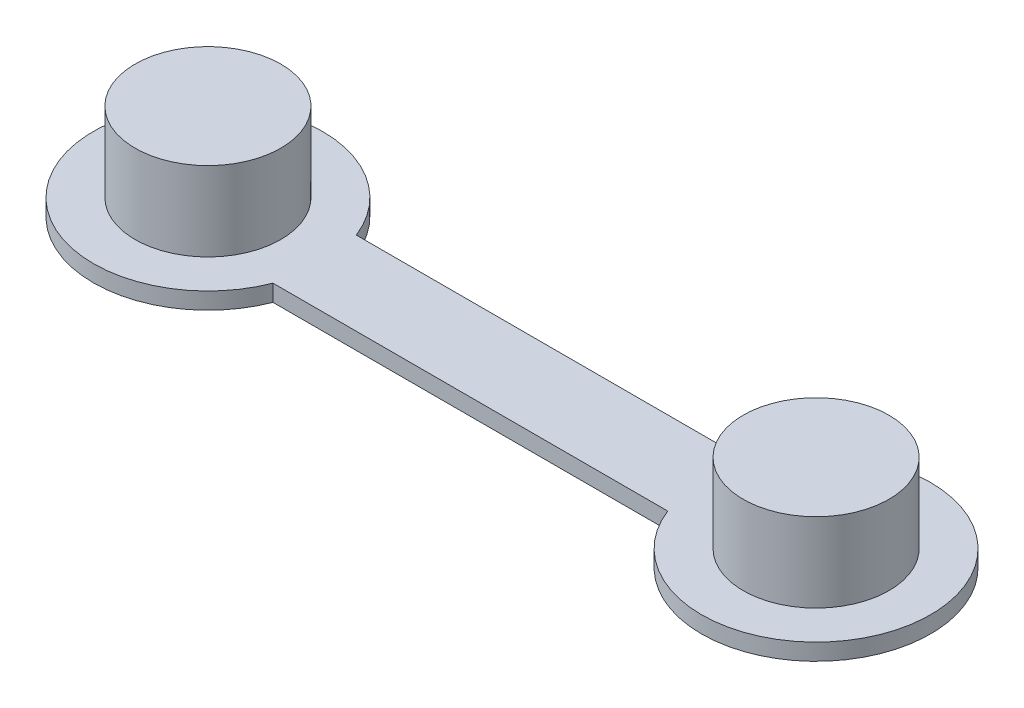
ISO-10303-21;
HEADER;
FILE_DESCRIPTION(('STEP AP214'),'2;1');
FILE_NAME('part.step','',(''),(''),'','','');
FILE_SCHEMA(('AUTOMOTIVE_DESIGN { 1 0 10303 214 1 1 1 1 }'));
ENDSEC;
DATA;
#1=APPLICATION_CONTEXT('core data for automotive mechanical design processes');
#2=APPLICATION_PROTOCOL_DEFINITION('international standard','automotive_design',2000,#1);
#3=PRODUCT_CONTEXT('',#1,'mechanical');
#4=PRODUCT('Part','Part','',(#3));
#5=PRODUCT_RELATED_PRODUCT_CATEGORY('part','',(#4));
#6=PRODUCT_DEFINITION_FORMATION('','',#4);
#7=PRODUCT_DEFINITION_CONTEXT('part definition',#1,'design');
#8=PRODUCT_DEFINITION('design','',#6,#7);
#9=PRODUCT_DEFINITION_SHAPE('','',#8);
#10=(LENGTH_UNIT() NAMED_UNIT(*) SI_UNIT(.MILLI.,.METRE.));
#11=(NAMED_UNIT(*) PLANE_ANGLE_UNIT() SI_UNIT($,.RADIAN.));
#12=(NAMED_UNIT(*) SI_UNIT($,.STERADIAN.) SOLID_ANGLE_UNIT());
#13=UNCERTAINTY_MEASURE_WITH_UNIT(LENGTH_MEASURE(1.E-05),#10,'distance_accuracy_value','');
#14=(GEOMETRIC_REPRESENTATION_CONTEXT(3) GLOBAL_UNCERTAINTY_ASSIGNED_CONTEXT((#13)) GLOBAL_UNIT_ASSIGNED_CONTEXT((#10,
#11,#12)) REPRESENTATION_CONTEXT('',''));
#15=CARTESIAN_POINT('',(0.,0.,0.));
#16=DIRECTION('',(0.,0.,1.));
#17=DIRECTION('',(1.,0.,0.));
#18=AXIS2_PLACEMENT_3D('',#15,#16,#17);
#19=CARTESIAN_POINT('',(14.6,0.4,0.));
#20=DIRECTION('',(0.,-1.,0.));
#21=DIRECTION('',(0.,0.,-1.));
#22=AXIS2_PLACEMENT_3D('',#19,#20,#21);
#23=CYLINDRICAL_SURFACE('',#22,2.75);
#24=CARTESIAN_POINT('',(14.6,0.,0.));
#25=DIRECTION('',(0.,1.,0.));
#26=DIRECTION('',(0.,0.,1.));
#27=AXIS2_PLACEMENT_3D('',#24,#25,#26);
#28=CIRCLE('',#27,2.75);
#29=CARTESIAN_POINT('',(12.0382623085101,0.,1.));
#30=VERTEX_POINT('',#29);
#31=CARTESIAN_POINT('',(12.0382623085101,0.,-1.));
#32=VERTEX_POINT('',#31);
#33=EDGE_CURVE('E111',#30,#32,#28,.T.);
#34=ORIENTED_EDGE('',*,*,#33,.T.);
#35=DIRECTION('',(0.,-1.,0.));
#36=VECTOR('',#35,1.);
#37=CARTESIAN_POINT('',(12.0382623085101,0.4,-1.));
#38=LINE('',#37,#36);
#39=CARTESIAN_POINT('',(12.0382623085101,0.4,-1.));
#40=VERTEX_POINT('',#39);
#41=EDGE_CURVE('E11',#40,#32,#38,.T.);
#42=ORIENTED_EDGE('',*,*,#41,.F.);
#43=CARTESIAN_POINT('',(14.6,0.4,0.));
#44=DIRECTION('',(0.,1.,0.));
#45=DIRECTION('',(0.,0.,1.));
#46=AXIS2_PLACEMENT_3D('',#43,#44,#45);
#47=CIRCLE('',#46,2.75);
#48=CARTESIAN_POINT('',(12.0382623085101,0.4,1.));
#49=VERTEX_POINT('',#48);
#50=EDGE_CURVE('E95',#49,#40,#47,.T.);
#51=ORIENTED_EDGE('',*,*,#50,.F.);
#52=DIRECTION('',(0.,-1.,0.));
#53=VECTOR('',#52,1.);
#54=CARTESIAN_POINT('',(12.0382623085101,0.4,1.));
#55=LINE('',#54,#53);
#56=EDGE_CURVE('E107',#49,#30,#55,.T.);
#57=ORIENTED_EDGE('',*,*,#56,.T.);
#58=EDGE_LOOP('',(#34,#42,#51,#57));
#59=FACE_BOUND('',#58,.T.);
#60=ADVANCED_FACE('F43',(#59),#23,.T.);
#61=CARTESIAN_POINT('',(2.5617376914899,0.4,-1.));
#62=DIRECTION('',(0.,0.,1.));
#63=DIRECTION('',(1.,0.,0.));
#64=AXIS2_PLACEMENT_3D('',#61,#62,#63);
#65=PLANE('',#64);
#66=DIRECTION('',(-1.,0.,0.));
#67=VECTOR('',#66,1.);
#68=CARTESIAN_POINT('',(2.5617376914899,0.,-1.));
#69=LINE('',#68,#67);
#70=CARTESIAN_POINT('',(2.5617376914899,0.,-1.));
#71=VERTEX_POINT('',#70);
#72=EDGE_CURVE('E100',#32,#71,#69,.T.);
#73=ORIENTED_EDGE('',*,*,#72,.T.);
#74=DIRECTION('',(0.,-1.,0.));
#75=VECTOR('',#74,1.);
#76=CARTESIAN_POINT('',(2.5617376914899,0.4,-1.));
#77=LINE('',#76,#75);
#78=CARTESIAN_POINT('',(2.5617376914899,0.4,-1.));
#79=VERTEX_POINT('',#78);
#80=EDGE_CURVE('E52',#79,#71,#77,.T.);
#81=ORIENTED_EDGE('',*,*,#80,.F.);
#82=DIRECTION('',(-1.,0.,0.));
#83=VECTOR('',#82,1.);
#84=CARTESIAN_POINT('',(2.5617376914899,0.4,-1.));
#85=LINE('',#84,#83);
#86=EDGE_CURVE('E90',#40,#79,#85,.T.);
#87=ORIENTED_EDGE('',*,*,#86,.F.);
#88=ORIENTED_EDGE('',*,*,#41,.T.);
#89=EDGE_LOOP('',(#73,#81,#87,#88));
#90=FACE_BOUND('',#89,.T.);
#91=ADVANCED_FACE('F99',(#90),#65,.F.);
#92=CARTESIAN_POINT('',(0.,0.4,0.));
#93=DIRECTION('',(0.,-1.,0.));
#94=DIRECTION('',(0.,0.,-1.));
#95=AXIS2_PLACEMENT_3D('',#92,#93,#94);
#96=CYLINDRICAL_SURFACE('',#95,2.75);
#97=CARTESIAN_POINT('',(0.,0.,0.));
#98=DIRECTION('',(0.,1.,0.));
#99=DIRECTION('',(0.,0.,1.));
#100=AXIS2_PLACEMENT_3D('',#97,#98,#99);
#101=CIRCLE('',#100,2.75);
#102=CARTESIAN_POINT('',(2.5617376914899,0.,1.));
#103=VERTEX_POINT('',#102);
#104=EDGE_CURVE('E77',#71,#103,#101,.T.);
#105=ORIENTED_EDGE('',*,*,#104,.T.);
#106=DIRECTION('',(0.,-1.,0.));
#107=VECTOR('',#106,1.);
#108=CARTESIAN_POINT('',(2.5617376914899,0.4,1.));
#109=LINE('',#108,#107);
#110=CARTESIAN_POINT('',(2.5617376914899,0.4,1.));
#111=VERTEX_POINT('',#110);
#112=EDGE_CURVE('E102',#111,#103,#109,.T.);
#113=ORIENTED_EDGE('',*,*,#112,.F.);
#114=CARTESIAN_POINT('',(0.,0.4,0.));
#115=DIRECTION('',(0.,1.,0.));
#116=DIRECTION('',(0.,0.,1.));
#117=AXIS2_PLACEMENT_3D('',#114,#115,#116);
#118=CIRCLE('',#117,2.75);
#119=EDGE_CURVE('E93',#79,#111,#118,.T.);
#120=ORIENTED_EDGE('',*,*,#119,.F.);
#121=ORIENTED_EDGE('',*,*,#80,.T.);
#122=EDGE_LOOP('',(#105,#113,#120,#121));
#123=FACE_BOUND('',#122,.T.);
#124=ADVANCED_FACE('F103',(#123),#96,.T.);
#125=CARTESIAN_POINT('',(12.0382623085101,0.4,1.));
#126=DIRECTION('',(0.,0.,-1.));
#127=DIRECTION('',(-1.,0.,0.));
#128=AXIS2_PLACEMENT_3D('',#125,#126,#127);
#129=PLANE('',#128);
#130=DIRECTION('',(1.,0.,0.));
#131=VECTOR('',#130,1.);
#132=CARTESIAN_POINT('',(12.0382623085101,0.,1.));
#133=LINE('',#132,#131);
#134=EDGE_CURVE('E83',#103,#30,#133,.T.);
#135=ORIENTED_EDGE('',*,*,#134,.T.);
#136=ORIENTED_EDGE('',*,*,#56,.F.);
#137=DIRECTION('',(1.,0.,0.));
#138=VECTOR('',#137,1.);
#139=CARTESIAN_POINT('',(12.0382623085101,0.4,1.));
#140=LINE('',#139,#138);
#141=EDGE_CURVE('E60',#111,#49,#140,.T.);
#142=ORIENTED_EDGE('',*,*,#141,.F.);
#143=ORIENTED_EDGE('',*,*,#112,.T.);
#144=EDGE_LOOP('',(#135,#136,#142,#143));
#145=FACE_BOUND('',#144,.T.);
#146=ADVANCED_FACE('F125',(#145),#129,.F.);
#147=CARTESIAN_POINT('',(14.6,0.4,0.));
#148=DIRECTION('',(0.,1.,0.));
#149=DIRECTION('',(0.,0.,1.));
#150=AXIS2_PLACEMENT_3D('',#147,#148,#149);
#151=PLANE('',#150);
#152=CARTESIAN_POINT('',(14.6,0.4,0.));
#153=DIRECTION('',(0.,1.,0.));
#154=DIRECTION('',(0.,0.,1.));
#155=AXIS2_PLACEMENT_3D('',#152,#153,#154);
#156=CIRCLE('',#155,1.75);
#157=CARTESIAN_POINT('',(14.6,0.4,-1.75));
#158=VERTEX_POINT('',#157);
#159=EDGE_CURVE('E136',#158,#158,#156,.T.);
#160=ORIENTED_EDGE('',*,*,#159,.F.);
#161=EDGE_LOOP('',(#160));
#162=FACE_BOUND('',#161,.T.);
#163=CARTESIAN_POINT('',(0.,0.4,0.));
#164=DIRECTION('',(0.,1.,0.));
#165=DIRECTION('',(0.,0.,1.));
#166=AXIS2_PLACEMENT_3D('',#163,#164,#165);
#167=CIRCLE('',#166,1.75);
#168=CARTESIAN_POINT('',(0.,0.4,-1.75));
#169=VERTEX_POINT('',#168);
#170=EDGE_CURVE('E132',#169,#169,#167,.T.);
#171=ORIENTED_EDGE('',*,*,#170,.F.);
#172=EDGE_LOOP('',(#171));
#173=FACE_BOUND('',#172,.T.);
#174=ORIENTED_EDGE('',*,*,#50,.T.);
#175=ORIENTED_EDGE('',*,*,#86,.T.);
#176=ORIENTED_EDGE('',*,*,#119,.T.);
#177=ORIENTED_EDGE('',*,*,#141,.T.);
#178=EDGE_LOOP('',(#174,#175,#176,#177));
#179=FACE_BOUND('',#178,.T.);
#180=ADVANCED_FACE('F91',(#162,#173,#179),#151,.T.);
#181=CARTESIAN_POINT('',(14.6,0.,0.));
#182=DIRECTION('',(0.,1.,0.));
#183=DIRECTION('',(0.,0.,1.));
#184=AXIS2_PLACEMENT_3D('',#181,#182,#183);
#185=PLANE('',#184);
#186=ORIENTED_EDGE('',*,*,#33,.F.);
#187=ORIENTED_EDGE('',*,*,#134,.F.);
#188=ORIENTED_EDGE('',*,*,#104,.F.);
#189=ORIENTED_EDGE('',*,*,#72,.F.);
#190=EDGE_LOOP('',(#186,#187,#188,#189));
#191=FACE_BOUND('',#190,.T.);
#192=ADVANCED_FACE('F128',(#191),#185,.F.);
#193=CARTESIAN_POINT('',(0.,2.3,0.));
#194=DIRECTION('',(0.,-1.,0.));
#195=DIRECTION('',(0.,0.,-1.));
#196=AXIS2_PLACEMENT_3D('',#193,#194,#195);
#197=CYLINDRICAL_SURFACE('',#196,1.75);
#198=CARTESIAN_POINT('',(0.,2.3,0.));
#199=DIRECTION('',(0.,1.,0.));
#200=DIRECTION('',(0.,0.,1.));
#201=AXIS2_PLACEMENT_3D('',#198,#199,#200);
#202=CIRCLE('',#201,1.75);
#203=CARTESIAN_POINT('',(0.,2.3,-1.75));
#204=VERTEX_POINT('',#203);
#205=EDGE_CURVE('E115',#204,#204,#202,.T.);
#206=CARTESIAN_POINT('',(0.,2.3,-1.75));
#207=CARTESIAN_POINT('',(0.,2.28020833333333,-1.75));
#208=CARTESIAN_POINT('',(0.,2.26041666666667,-1.75));
#209=CARTESIAN_POINT('',(0.,2.22083333333333,-1.75));
#210=CARTESIAN_POINT('',(0.,2.20104166666667,-1.75));
#211=CARTESIAN_POINT('',(0.,2.16145833333333,-1.75));
#212=CARTESIAN_POINT('',(0.,2.14166666666667,-1.75));
#213=CARTESIAN_POINT('',(0.,2.10208333333333,-1.75));
#214=CARTESIAN_POINT('',(0.,2.08229166666667,-1.75));
#215=CARTESIAN_POINT('',(0.,2.04270833333333,-1.75));
#216=CARTESIAN_POINT('',(0.,2.02291666666667,-1.75));
#217=CARTESIAN_POINT('',(0.,1.98333333333333,-1.75));
#218=CARTESIAN_POINT('',(0.,1.96354166666667,-1.75));
#219=CARTESIAN_POINT('',(0.,1.92395833333333,-1.75));
#220=CARTESIAN_POINT('',(0.,1.90416666666667,-1.75));
#221=CARTESIAN_POINT('',(0.,1.86458333333333,-1.75));
#222=CARTESIAN_POINT('',(0.,1.84479166666667,-1.75));
#223=CARTESIAN_POINT('',(0.,1.80520833333333,-1.75));
#224=CARTESIAN_POINT('',(0.,1.78541666666667,-1.75));
#225=CARTESIAN_POINT('',(0.,1.74583333333333,-1.75));
#226=CARTESIAN_POINT('',(0.,1.72604166666667,-1.75));
#227=CARTESIAN_POINT('',(0.,1.68645833333333,-1.75));
#228=CARTESIAN_POINT('',(0.,1.66666666666667,-1.75));
#229=CARTESIAN_POINT('',(0.,1.62708333333333,-1.75));
#230=CARTESIAN_POINT('',(0.,1.60729166666667,-1.75));
#231=CARTESIAN_POINT('',(0.,1.56770833333333,-1.75));
#232=CARTESIAN_POINT('',(0.,1.54791666666667,-1.75));
#233=CARTESIAN_POINT('',(0.,1.50833333333333,-1.75));
#234=CARTESIAN_POINT('',(0.,1.48854166666667,-1.75));
#235=CARTESIAN_POINT('',(0.,1.44895833333333,-1.75));
#236=CARTESIAN_POINT('',(0.,1.42916666666667,-1.75));
#237=CARTESIAN_POINT('',(0.,1.38958333333333,-1.75));
#238=CARTESIAN_POINT('',(0.,1.36979166666667,-1.75));
#239=CARTESIAN_POINT('',(0.,1.33020833333333,-1.75));
#240=CARTESIAN_POINT('',(0.,1.31041666666667,-1.75));
#241=CARTESIAN_POINT('',(0.,1.27083333333333,-1.75));
#242=CARTESIAN_POINT('',(0.,1.25104166666667,-1.75));
#243=CARTESIAN_POINT('',(0.,1.21145833333333,-1.75));
#244=CARTESIAN_POINT('',(0.,1.19166666666667,-1.75));
#245=CARTESIAN_POINT('',(0.,1.15208333333333,-1.75));
#246=CARTESIAN_POINT('',(0.,1.13229166666667,-1.75));
#247=CARTESIAN_POINT('',(0.,1.09270833333333,-1.75));
#248=CARTESIAN_POINT('',(0.,1.07291666666667,-1.75));
#249=CARTESIAN_POINT('',(0.,1.03333333333333,-1.75));
#250=CARTESIAN_POINT('',(0.,1.01354166666667,-1.75));
#251=CARTESIAN_POINT('',(0.,0.973958333333333,-1.75));
#252=CARTESIAN_POINT('',(0.,0.954166666666667,-1.75));
#253=CARTESIAN_POINT('',(0.,0.914583333333333,-1.75));
#254=CARTESIAN_POINT('',(0.,0.894791666666667,-1.75));
#255=CARTESIAN_POINT('',(0.,0.855208333333333,-1.75));
#256=CARTESIAN_POINT('',(0.,0.835416666666667,-1.75));
#257=CARTESIAN_POINT('',(0.,0.795833333333333,-1.75));
#258=CARTESIAN_POINT('',(0.,0.776041666666667,-1.75));
#259=CARTESIAN_POINT('',(0.,0.736458333333333,-1.75));
#260=CARTESIAN_POINT('',(0.,0.716666666666667,-1.75));
#261=CARTESIAN_POINT('',(0.,0.677083333333333,-1.75));
#262=CARTESIAN_POINT('',(0.,0.657291666666667,-1.75));
#263=CARTESIAN_POINT('',(0.,0.617708333333333,-1.75));
#264=CARTESIAN_POINT('',(0.,0.597916666666667,-1.75));
#265=CARTESIAN_POINT('',(0.,0.558333333333333,-1.75));
#266=CARTESIAN_POINT('',(0.,0.538541666666667,-1.75));
#267=CARTESIAN_POINT('',(0.,0.498958333333333,-1.75));
#268=CARTESIAN_POINT('',(0.,0.479166666666667,-1.75));
#269=CARTESIAN_POINT('',(0.,0.439583333333333,-1.75));
#270=CARTESIAN_POINT('',(0.,0.419791666666667,-1.75));
#271=CARTESIAN_POINT('',(0.,0.4,-1.75));
#272=B_SPLINE_CURVE_WITH_KNOTS('',3,(#206,#207,#208,#209,#210,#211,#212,#213,#214,#215,#216,
#217,#218,#219,#220,#221,#222,#223,#224,#225,#226,#227,#228,#229,#230,#231,#232,#233,#234,#235,
#236,#237,#238,#239,#240,#241,#242,#243,#244,#245,#246,#247,#248,#249,#250,#251,#252,#253,#254,
#255,#256,#257,#258,#259,#260,#261,#262,#263,#264,#265,#266,#267,#268,#269,#270,#271),
.UNSPECIFIED.,.F.,.F.,(4,2,2,2,2,2,2,2,2,2,2,2,2,2,2,2,2,2,2,2,2,2,2,2,2,2,2,2,2,2,2,2,4),(0.,
0.0593750000000004,0.11875,0.178125,0.2375,0.296875,0.35625,0.415625,0.475,0.534375,0.59375,
0.653125,0.7125,0.771875,0.83125,0.890625,0.95,1.009375,1.06875,1.128125,1.1875,1.246875,
1.30625,1.365625,1.425,1.484375,1.54375,1.603125,1.6625,1.721875,1.78125,1.840625,1.9),.UNSPECIFIED.);
#273=EDGE_CURVE('BSEAM155',#204,#169,#272,.T.);
#274=ORIENTED_EDGE('',*,*,#205,.F.);
#275=ORIENTED_EDGE('',*,*,#170,.T.);
#276=ORIENTED_EDGE('',*,*,#273,.T.);
#277=ORIENTED_EDGE('',*,*,#273,.F.);
#278=EDGE_LOOP('',(#274,#276,#275,#277));
#279=FACE_BOUND('',#278,.T.);
#280=ADVANCED_FACE('F155',(#279),#197,.T.);
#281=CARTESIAN_POINT('',(0.,2.3,0.));
#282=DIRECTION('',(0.,1.,0.));
#283=DIRECTION('',(0.,0.,1.));
#284=AXIS2_PLACEMENT_3D('',#281,#282,#283);
#285=PLANE('',#284);
#286=ORIENTED_EDGE('',*,*,#205,.T.);
#287=EDGE_LOOP('',(#286));
#288=FACE_BOUND('',#287,.T.);
#289=ADVANCED_FACE('F157',(#288),#285,.T.);
#290=CARTESIAN_POINT('',(14.6,2.3,0.));
#291=DIRECTION('',(0.,-1.,0.));
#292=DIRECTION('',(0.,0.,-1.));
#293=AXIS2_PLACEMENT_3D('',#290,#291,#292);
#294=CYLINDRICAL_SURFACE('',#293,1.75);
#295=CARTESIAN_POINT('',(14.6,2.3,0.));
#296=DIRECTION('',(0.,1.,0.));
#297=DIRECTION('',(0.,0.,1.));
#298=AXIS2_PLACEMENT_3D('',#295,#296,#297);
#299=CIRCLE('',#298,1.75);
#300=CARTESIAN_POINT('',(14.6,2.3,-1.75));
#301=VERTEX_POINT('',#300);
#302=EDGE_CURVE('E140',#301,#301,#299,.T.);
#303=CARTESIAN_POINT('',(14.6,2.3,-1.75));
#304=CARTESIAN_POINT('',(14.6,2.28020833333333,-1.75));
#305=CARTESIAN_POINT('',(14.6,2.26041666666667,-1.75));
#306=CARTESIAN_POINT('',(14.6,2.22083333333333,-1.75));
#307=CARTESIAN_POINT('',(14.6,2.20104166666667,-1.75));
#308=CARTESIAN_POINT('',(14.6,2.16145833333333,-1.75));
#309=CARTESIAN_POINT('',(14.6,2.14166666666667,-1.75));
#310=CARTESIAN_POINT('',(14.6,2.10208333333333,-1.75));
#311=CARTESIAN_POINT('',(14.6,2.08229166666667,-1.75));
#312=CARTESIAN_POINT('',(14.6,2.04270833333333,-1.75));
#313=CARTESIAN_POINT('',(14.6,2.02291666666667,-1.75));
#314=CARTESIAN_POINT('',(14.6,1.98333333333333,-1.75));
#315=CARTESIAN_POINT('',(14.6,1.96354166666667,-1.75));
#316=CARTESIAN_POINT('',(14.6,1.92395833333333,-1.75));
#317=CARTESIAN_POINT('',(14.6,1.90416666666667,-1.75));
#318=CARTESIAN_POINT('',(14.6,1.86458333333333,-1.75));
#319=CARTESIAN_POINT('',(14.6,1.84479166666667,-1.75));
#320=CARTESIAN_POINT('',(14.6,1.80520833333333,-1.75));
#321=CARTESIAN_POINT('',(14.6,1.78541666666667,-1.75));
#322=CARTESIAN_POINT('',(14.6,1.74583333333333,-1.75));
#323=CARTESIAN_POINT('',(14.6,1.72604166666667,-1.75));
#324=CARTESIAN_POINT('',(14.6,1.68645833333333,-1.75));
#325=CARTESIAN_POINT('',(14.6,1.66666666666667,-1.75));
#326=CARTESIAN_POINT('',(14.6,1.62708333333333,-1.75));
#327=CARTESIAN_POINT('',(14.6,1.60729166666667,-1.75));
#328=CARTESIAN_POINT('',(14.6,1.56770833333333,-1.75));
#329=CARTESIAN_POINT('',(14.6,1.54791666666667,-1.75));
#330=CARTESIAN_POINT('',(14.6,1.50833333333333,-1.75));
#331=CARTESIAN_POINT('',(14.6,1.48854166666667,-1.75));
#332=CARTESIAN_POINT('',(14.6,1.44895833333333,-1.75));
#333=CARTESIAN_POINT('',(14.6,1.42916666666667,-1.75));
#334=CARTESIAN_POINT('',(14.6,1.38958333333333,-1.75));
#335=CARTESIAN_POINT('',(14.6,1.36979166666667,-1.75));
#336=CARTESIAN_POINT('',(14.6,1.33020833333333,-1.75));
#337=CARTESIAN_POINT('',(14.6,1.31041666666667,-1.75));
#338=CARTESIAN_POINT('',(14.6,1.27083333333333,-1.75));
#339=CARTESIAN_POINT('',(14.6,1.25104166666667,-1.75));
#340=CARTESIAN_POINT('',(14.6,1.21145833333333,-1.75));
#341=CARTESIAN_POINT('',(14.6,1.19166666666667,-1.75));
#342=CARTESIAN_POINT('',(14.6,1.15208333333333,-1.75));
#343=CARTESIAN_POINT('',(14.6,1.13229166666667,-1.75));
#344=CARTESIAN_POINT('',(14.6,1.09270833333333,-1.75));
#345=CARTESIAN_POINT('',(14.6,1.07291666666667,-1.75));
#346=CARTESIAN_POINT('',(14.6,1.03333333333333,-1.75));
#347=CARTESIAN_POINT('',(14.6,1.01354166666667,-1.75));
#348=CARTESIAN_POINT('',(14.6,0.973958333333333,-1.75));
#349=CARTESIAN_POINT('',(14.6,0.954166666666667,-1.75));
#350=CARTESIAN_POINT('',(14.6,0.914583333333333,-1.75));
#351=CARTESIAN_POINT('',(14.6,0.894791666666667,-1.75));
#352=CARTESIAN_POINT('',(14.6,0.855208333333333,-1.75));
#353=CARTESIAN_POINT('',(14.6,0.835416666666667,-1.75));
#354=CARTESIAN_POINT('',(14.6,0.795833333333333,-1.75));
#355=CARTESIAN_POINT('',(14.6,0.776041666666667,-1.75));
#356=CARTESIAN_POINT('',(14.6,0.736458333333333,-1.75));
#357=CARTESIAN_POINT('',(14.6,0.716666666666667,-1.75));
#358=CARTESIAN_POINT('',(14.6,0.677083333333333,-1.75));
#359=CARTESIAN_POINT('',(14.6,0.657291666666667,-1.75));
#360=CARTESIAN_POINT('',(14.6,0.617708333333333,-1.75));
#361=CARTESIAN_POINT('',(14.6,0.597916666666667,-1.75));
#362=CARTESIAN_POINT('',(14.6,0.558333333333333,-1.75));
#363=CARTESIAN_POINT('',(14.6,0.538541666666667,-1.75));
#364=CARTESIAN_POINT('',(14.6,0.498958333333333,-1.75));
#365=CARTESIAN_POINT('',(14.6,0.479166666666667,-1.75));
#366=CARTESIAN_POINT('',(14.6,0.439583333333333,-1.75));
#367=CARTESIAN_POINT('',(14.6,0.419791666666667,-1.75));
#368=CARTESIAN_POINT('',(14.6,0.4,-1.75));
#369=B_SPLINE_CURVE_WITH_KNOTS('',3,(#303,#304,#305,#306,#307,#308,#309,#310,#311,#312,#313,
#314,#315,#316,#317,#318,#319,#320,#321,#322,#323,#324,#325,#326,#327,#328,#329,#330,#331,#332,
#333,#334,#335,#336,#337,#338,#339,#340,#341,#342,#343,#344,#345,#346,#347,#348,#349,#350,#351,
#352,#353,#354,#355,#356,#357,#358,#359,#360,#361,#362,#363,#364,#365,#366,#367,#368),
.UNSPECIFIED.,.F.,.F.,(4,2,2,2,2,2,2,2,2,2,2,2,2,2,2,2,2,2,2,2,2,2,2,2,2,2,2,2,2,2,2,2,4),(0.,
0.0593750000000004,0.11875,0.178125,0.2375,0.296875,0.35625,0.415625,0.475,0.534375,0.59375,
0.653125,0.7125,0.771875,0.83125,0.890625,0.95,1.009375,1.06875,1.128125,1.1875,1.246875,
1.30625,1.365625,1.425,1.484375,1.54375,1.603125,1.6625,1.721875,1.78125,1.840625,1.9),.UNSPECIFIED.);
#370=EDGE_CURVE('BSEAM148',#301,#158,#369,.T.);
#371=ORIENTED_EDGE('',*,*,#302,.F.);
#372=ORIENTED_EDGE('',*,*,#159,.T.);
#373=ORIENTED_EDGE('',*,*,#370,.T.);
#374=ORIENTED_EDGE('',*,*,#370,.F.);
#375=EDGE_LOOP('',(#371,#373,#372,#374));
#376=FACE_BOUND('',#375,.T.);
#377=ADVANCED_FACE('F148',(#376),#294,.T.);
#378=CARTESIAN_POINT('',(14.6,2.3,0.));
#379=DIRECTION('',(0.,1.,0.));
#380=DIRECTION('',(0.,0.,1.));
#381=AXIS2_PLACEMENT_3D('',#378,#379,#380);
#382=PLANE('',#381);
#383=ORIENTED_EDGE('',*,*,#302,.T.);
#384=EDGE_LOOP('',(#383));
#385=FACE_BOUND('',#384,.T.);
#386=ADVANCED_FACE('F219',(#385),#382,.T.);
#387=CLOSED_SHELL('',(#60,#91,#124,#146,#180,#192,#280,#289,#377,#386));
#388=MANIFOLD_SOLID_BREP('B2',#387);
#389=ADVANCED_BREP_SHAPE_REPRESENTATION('',(#18,#388),#14);
#390=SHAPE_DEFINITION_REPRESENTATION(#9,#389);
ENDSEC;
END-ISO-10303-21;
